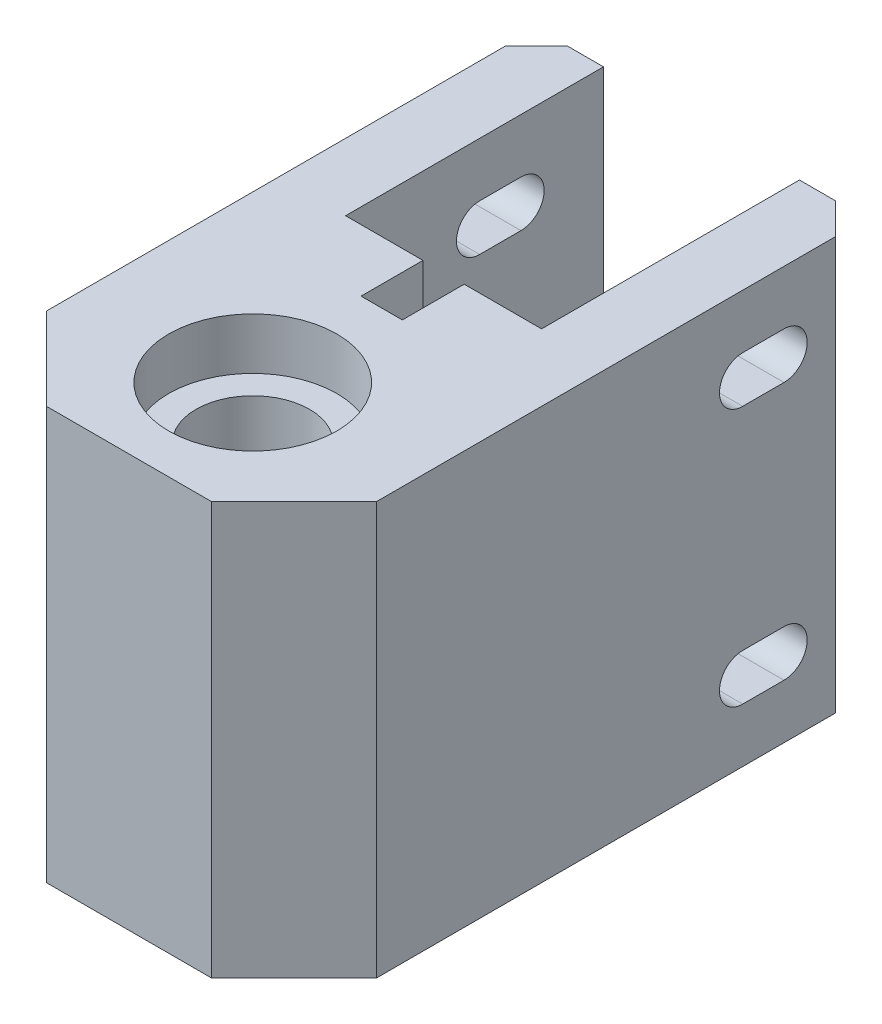
ISO-10303-21;
HEADER;
FILE_DESCRIPTION(('STEP AP214'),'2;1');
FILE_NAME('part.step','',(''),(''),'','','');
FILE_SCHEMA(('AUTOMOTIVE_DESIGN { 1 0 10303 214 1 1 1 1 }'));
ENDSEC;
DATA;
#1=APPLICATION_CONTEXT('core data for automotive mechanical design processes');
#2=APPLICATION_PROTOCOL_DEFINITION('international standard','automotive_design',2000,#1);
#3=PRODUCT_CONTEXT('',#1,'mechanical');
#4=PRODUCT('Part','Part','',(#3));
#5=PRODUCT_RELATED_PRODUCT_CATEGORY('part','',(#4));
#6=PRODUCT_DEFINITION_FORMATION('','',#4);
#7=PRODUCT_DEFINITION_CONTEXT('part definition',#1,'design');
#8=PRODUCT_DEFINITION('design','',#6,#7);
#9=PRODUCT_DEFINITION_SHAPE('','',#8);
#10=(LENGTH_UNIT() NAMED_UNIT(*) SI_UNIT(.MILLI.,.METRE.));
#11=(NAMED_UNIT(*) PLANE_ANGLE_UNIT() SI_UNIT($,.RADIAN.));
#12=(NAMED_UNIT(*) SI_UNIT($,.STERADIAN.) SOLID_ANGLE_UNIT());
#13=UNCERTAINTY_MEASURE_WITH_UNIT(LENGTH_MEASURE(1.E-05),#10,'distance_accuracy_value','');
#14=(GEOMETRIC_REPRESENTATION_CONTEXT(3) GLOBAL_UNCERTAINTY_ASSIGNED_CONTEXT((#13)) GLOBAL_UNIT_ASSIGNED_CONTEXT((#10,
#11,#12)) REPRESENTATION_CONTEXT('',''));
#15=CARTESIAN_POINT('',(0.,0.,0.));
#16=DIRECTION('',(0.,0.,1.));
#17=DIRECTION('',(1.,0.,0.));
#18=AXIS2_PLACEMENT_3D('',#15,#16,#17);
#19=CARTESIAN_POINT('',(0.,20.,0.));
#20=DIRECTION('',(0.,-1.,0.));
#21=DIRECTION('',(0.,0.,-1.));
#22=AXIS2_PLACEMENT_3D('',#19,#20,#21);
#23=CYLINDRICAL_SURFACE('',#22,5.5);
#24=CARTESIAN_POINT('',(0.,15.,0.));
#25=DIRECTION('',(0.,1.,0.));
#26=DIRECTION('',(0.,0.,1.));
#27=AXIS2_PLACEMENT_3D('',#24,#25,#26);
#28=CIRCLE('',#27,5.5);
#29=CARTESIAN_POINT('',(0.,15.,5.5));
#30=VERTEX_POINT('',#29);
#31=EDGE_CURVE('E359',#30,#30,#28,.T.);
#32=ORIENTED_EDGE('',*,*,#31,.T.);
#33=EDGE_LOOP('',(#32));
#34=FACE_BOUND('',#33,.T.);
#35=CARTESIAN_POINT('',(0.,-15.,0.));
#36=DIRECTION('',(0.,-1.,0.));
#37=DIRECTION('',(0.,0.,-1.));
#38=AXIS2_PLACEMENT_3D('',#35,#36,#37);
#39=CIRCLE('',#38,5.5);
#40=CARTESIAN_POINT('',(0.,-15.,-5.5));
#41=VERTEX_POINT('',#40);
#42=EDGE_CURVE('E353',#41,#41,#39,.T.);
#43=ORIENTED_EDGE('',*,*,#42,.T.);
#44=EDGE_LOOP('',(#43));
#45=FACE_BOUND('',#44,.T.);
#46=ADVANCED_FACE('F32',(#34,#45),#23,.F.);
#47=CARTESIAN_POINT('',(0.,-20.,0.));
#48=DIRECTION('',(0.,1.,0.));
#49=DIRECTION('',(0.,0.,1.));
#50=AXIS2_PLACEMENT_3D('',#47,#48,#49);
#51=PLANE('',#50);
#52=DIRECTION('',(-1.,0.,0.));
#53=VECTOR('',#52,1.);
#54=CARTESIAN_POINT('',(-9.5,-20.,-43.5));
#55=LINE('',#54,#53);
#56=CARTESIAN_POINT('',(-9.5,-20.,-43.5));
#57=VERTEX_POINT('',#56);
#58=CARTESIAN_POINT('',(-13.,-20.,-43.5));
#59=VERTEX_POINT('',#58);
#60=EDGE_CURVE('E398',#57,#59,#55,.T.);
#61=ORIENTED_EDGE('',*,*,#60,.F.);
#62=DIRECTION('',(0.,0.,-1.));
#63=VECTOR('',#62,1.);
#64=CARTESIAN_POINT('',(-9.5,-20.,-43.5));
#65=LINE('',#64,#63);
#66=CARTESIAN_POINT('',(-9.5,-20.,-18.5));
#67=VERTEX_POINT('',#66);
#68=EDGE_CURVE('E367',#67,#57,#65,.T.);
#69=ORIENTED_EDGE('',*,*,#68,.F.);
#70=DIRECTION('',(-1.,0.,0.));
#71=VECTOR('',#70,1.);
#72=CARTESIAN_POINT('',(-9.5,-20.,-18.5));
#73=LINE('',#72,#71);
#74=CARTESIAN_POINT('',(-2.,-20.,-18.5));
#75=VERTEX_POINT('',#74);
#76=EDGE_CURVE('E427',#75,#67,#73,.T.);
#77=ORIENTED_EDGE('',*,*,#76,.F.);
#78=DIRECTION('',(0.,0.,-1.));
#79=VECTOR('',#78,1.);
#80=CARTESIAN_POINT('',(-2.,-20.,-18.5));
#81=LINE('',#80,#79);
#82=CARTESIAN_POINT('',(-2.,-20.,-12.5));
#83=VERTEX_POINT('',#82);
#84=EDGE_CURVE('E425',#83,#75,#81,.T.);
#85=ORIENTED_EDGE('',*,*,#84,.F.);
#86=DIRECTION('',(-1.,0.,0.));
#87=VECTOR('',#86,1.);
#88=CARTESIAN_POINT('',(-2.,-20.,-12.5));
#89=LINE('',#88,#87);
#90=CARTESIAN_POINT('',(2.,-20.,-12.5));
#91=VERTEX_POINT('',#90);
#92=EDGE_CURVE('E423',#91,#83,#89,.T.);
#93=ORIENTED_EDGE('',*,*,#92,.F.);
#94=DIRECTION('',(0.,0.,1.));
#95=VECTOR('',#94,1.);
#96=CARTESIAN_POINT('',(2.,-20.,-18.5));
#97=LINE('',#96,#95);
#98=CARTESIAN_POINT('',(2.,-20.,-18.5));
#99=VERTEX_POINT('',#98);
#100=EDGE_CURVE('E421',#99,#91,#97,.T.);
#101=ORIENTED_EDGE('',*,*,#100,.F.);
#102=DIRECTION('',(-1.,0.,0.));
#103=VECTOR('',#102,1.);
#104=CARTESIAN_POINT('',(2.,-20.,-18.5));
#105=LINE('',#104,#103);
#106=CARTESIAN_POINT('',(9.5,-20.,-18.5));
#107=VERTEX_POINT('',#106);
#108=EDGE_CURVE('E419',#107,#99,#105,.T.);
#109=ORIENTED_EDGE('',*,*,#108,.F.);
#110=DIRECTION('',(0.,0.,1.));
#111=VECTOR('',#110,1.);
#112=CARTESIAN_POINT('',(9.5,-20.,-43.5));
#113=LINE('',#112,#111);
#114=CARTESIAN_POINT('',(9.5,-20.,-43.5));
#115=VERTEX_POINT('',#114);
#116=EDGE_CURVE('E417',#115,#107,#113,.T.);
#117=ORIENTED_EDGE('',*,*,#116,.F.);
#118=DIRECTION('',(-1.,0.,0.));
#119=VECTOR('',#118,1.);
#120=CARTESIAN_POINT('',(13.,-20.,-43.5));
#121=LINE('',#120,#119);
#122=CARTESIAN_POINT('',(13.,-20.,-43.5));
#123=VERTEX_POINT('',#122);
#124=EDGE_CURVE('E415',#123,#115,#121,.T.);
#125=ORIENTED_EDGE('',*,*,#124,.F.);
#126=DIRECTION('',(-0.707106781186547,0.,-0.707106781186548));
#127=VECTOR('',#126,1.);
#128=CARTESIAN_POINT('',(16.,-20.,-40.5));
#129=LINE('',#128,#127);
#130=CARTESIAN_POINT('',(16.,-20.,-40.5));
#131=VERTEX_POINT('',#130);
#132=EDGE_CURVE('E413',#131,#123,#129,.T.);
#133=ORIENTED_EDGE('',*,*,#132,.F.);
#134=DIRECTION('',(0.,0.,-1.));
#135=VECTOR('',#134,1.);
#136=CARTESIAN_POINT('',(16.,-20.,4.00000000000001));
#137=LINE('',#136,#135);
#138=CARTESIAN_POINT('',(16.,-20.,4.00000000000001));
#139=VERTEX_POINT('',#138);
#140=EDGE_CURVE('E411',#139,#131,#137,.T.);
#141=ORIENTED_EDGE('',*,*,#140,.F.);
#142=DIRECTION('',(0.707106781186546,0.,-0.707106781186549));
#143=VECTOR('',#142,1.);
#144=CARTESIAN_POINT('',(8.00000000000004,-20.,12.));
#145=LINE('',#144,#143);
#146=CARTESIAN_POINT('',(8.00000000000004,-20.,12.));
#147=VERTEX_POINT('',#146);
#148=EDGE_CURVE('E409',#147,#139,#145,.T.);
#149=ORIENTED_EDGE('',*,*,#148,.F.);
#150=DIRECTION('',(1.,0.,0.));
#151=VECTOR('',#150,1.);
#152=CARTESIAN_POINT('',(-8.00000000000001,-20.,12.));
#153=LINE('',#152,#151);
#154=CARTESIAN_POINT('',(-8.00000000000001,-20.,12.));
#155=VERTEX_POINT('',#154);
#156=EDGE_CURVE('E407',#155,#147,#153,.T.);
#157=ORIENTED_EDGE('',*,*,#156,.F.);
#158=DIRECTION('',(0.707106781186549,0.,0.707106781186546));
#159=VECTOR('',#158,1.);
#160=CARTESIAN_POINT('',(-16.,-20.,4.00000000000003));
#161=LINE('',#160,#159);
#162=CARTESIAN_POINT('',(-16.,-20.,4.00000000000003));
#163=VERTEX_POINT('',#162);
#164=EDGE_CURVE('E405',#163,#155,#161,.T.);
#165=ORIENTED_EDGE('',*,*,#164,.F.);
#166=DIRECTION('',(0.,0.,1.));
#167=VECTOR('',#166,1.);
#168=CARTESIAN_POINT('',(-16.,-20.,-40.5));
#169=LINE('',#168,#167);
#170=CARTESIAN_POINT('',(-16.,-20.,-40.5));
#171=VERTEX_POINT('',#170);
#172=EDGE_CURVE('E403',#171,#163,#169,.T.);
#173=ORIENTED_EDGE('',*,*,#172,.F.);
#174=DIRECTION('',(-0.707106781186546,0.,0.707106781186549));
#175=VECTOR('',#174,1.);
#176=CARTESIAN_POINT('',(-13.,-20.,-43.5));
#177=LINE('',#176,#175);
#178=EDGE_CURVE('E401',#59,#171,#177,.T.);
#179=ORIENTED_EDGE('',*,*,#178,.F.);
#180=EDGE_LOOP('',(#61,#69,#77,#85,#93,#101,#109,#117,#125,#133,#141,#149,#157,#165,#173,#179));
#181=FACE_BOUND('',#180,.T.);
#182=CARTESIAN_POINT('',(0.,-20.,0.));
#183=DIRECTION('',(0.,1.,0.));
#184=DIRECTION('',(0.,0.,1.));
#185=AXIS2_PLACEMENT_3D('',#182,#183,#184);
#186=CIRCLE('',#185,8.15);
#187=CARTESIAN_POINT('',(0.,-20.,8.15));
#188=VERTEX_POINT('',#187);
#189=EDGE_CURVE('E349',#188,#188,#186,.T.);
#190=ORIENTED_EDGE('',*,*,#189,.T.);
#191=EDGE_LOOP('',(#190));
#192=FACE_BOUND('',#191,.T.);
#193=ADVANCED_FACE('F519',(#181,#192),#51,.F.);
#194=CARTESIAN_POINT('',(0.,20.,0.));
#195=DIRECTION('',(0.,1.,0.));
#196=DIRECTION('',(0.,0.,1.));
#197=AXIS2_PLACEMENT_3D('',#194,#195,#196);
#198=PLANE('',#197);
#199=CARTESIAN_POINT('',(0.,20.,0.));
#200=DIRECTION('',(0.,1.,0.));
#201=DIRECTION('',(0.,0.,1.));
#202=AXIS2_PLACEMENT_3D('',#199,#200,#201);
#203=CIRCLE('',#202,8.15);
#204=CARTESIAN_POINT('',(0.,20.,8.15));
#205=VERTEX_POINT('',#204);
#206=EDGE_CURVE('E360',#205,#205,#203,.T.);
#207=ORIENTED_EDGE('',*,*,#206,.F.);
#208=EDGE_LOOP('',(#207));
#209=FACE_BOUND('',#208,.T.);
#210=DIRECTION('',(-1.,0.,0.));
#211=VECTOR('',#210,1.);
#212=CARTESIAN_POINT('',(-9.5,20.,-43.5));
#213=LINE('',#212,#211);
#214=CARTESIAN_POINT('',(-9.5,20.,-43.5));
#215=VERTEX_POINT('',#214);
#216=CARTESIAN_POINT('',(-13.,20.,-43.5));
#217=VERTEX_POINT('',#216);
#218=EDGE_CURVE('E363',#215,#217,#213,.T.);
#219=ORIENTED_EDGE('',*,*,#218,.T.);
#220=DIRECTION('',(-0.707106781186546,0.,0.707106781186549));
#221=VECTOR('',#220,1.);
#222=CARTESIAN_POINT('',(-13.,20.,-43.5));
#223=LINE('',#222,#221);
#224=CARTESIAN_POINT('',(-16.,20.,-40.5));
#225=VERTEX_POINT('',#224);
#226=EDGE_CURVE('E366',#217,#225,#223,.T.);
#227=ORIENTED_EDGE('',*,*,#226,.T.);
#228=DIRECTION('',(0.,0.,1.));
#229=VECTOR('',#228,1.);
#230=CARTESIAN_POINT('',(-16.,20.,-40.5));
#231=LINE('',#230,#229);
#232=CARTESIAN_POINT('',(-16.,20.,4.00000000000003));
#233=VERTEX_POINT('',#232);
#234=EDGE_CURVE('E369',#225,#233,#231,.T.);
#235=ORIENTED_EDGE('',*,*,#234,.T.);
#236=DIRECTION('',(0.707106781186549,0.,0.707106781186546));
#237=VECTOR('',#236,1.);
#238=CARTESIAN_POINT('',(-16.,20.,4.00000000000003));
#239=LINE('',#238,#237);
#240=CARTESIAN_POINT('',(-8.00000000000001,20.,12.));
#241=VERTEX_POINT('',#240);
#242=EDGE_CURVE('E371',#233,#241,#239,.T.);
#243=ORIENTED_EDGE('',*,*,#242,.T.);
#244=DIRECTION('',(1.,0.,0.));
#245=VECTOR('',#244,1.);
#246=CARTESIAN_POINT('',(-8.00000000000001,20.,12.));
#247=LINE('',#246,#245);
#248=CARTESIAN_POINT('',(8.00000000000004,20.,12.));
#249=VERTEX_POINT('',#248);
#250=EDGE_CURVE('E373',#241,#249,#247,.T.);
#251=ORIENTED_EDGE('',*,*,#250,.T.);
#252=DIRECTION('',(0.707106781186546,0.,-0.707106781186549));
#253=VECTOR('',#252,1.);
#254=CARTESIAN_POINT('',(8.00000000000004,20.,12.));
#255=LINE('',#254,#253);
#256=CARTESIAN_POINT('',(16.,20.,4.00000000000001));
#257=VERTEX_POINT('',#256);
#258=EDGE_CURVE('E375',#249,#257,#255,.T.);
#259=ORIENTED_EDGE('',*,*,#258,.T.);
#260=DIRECTION('',(0.,0.,-1.));
#261=VECTOR('',#260,1.);
#262=CARTESIAN_POINT('',(16.,20.,4.00000000000001));
#263=LINE('',#262,#261);
#264=CARTESIAN_POINT('',(16.,20.,-40.5));
#265=VERTEX_POINT('',#264);
#266=EDGE_CURVE('E377',#257,#265,#263,.T.);
#267=ORIENTED_EDGE('',*,*,#266,.T.);
#268=DIRECTION('',(-0.707106781186547,0.,-0.707106781186548));
#269=VECTOR('',#268,1.);
#270=CARTESIAN_POINT('',(16.,20.,-40.5));
#271=LINE('',#270,#269);
#272=CARTESIAN_POINT('',(13.,20.,-43.5));
#273=VERTEX_POINT('',#272);
#274=EDGE_CURVE('E379',#265,#273,#271,.T.);
#275=ORIENTED_EDGE('',*,*,#274,.T.);
#276=DIRECTION('',(-1.,0.,0.));
#277=VECTOR('',#276,1.);
#278=CARTESIAN_POINT('',(13.,20.,-43.5));
#279=LINE('',#278,#277);
#280=CARTESIAN_POINT('',(9.5,20.,-43.5));
#281=VERTEX_POINT('',#280);
#282=EDGE_CURVE('E381',#273,#281,#279,.T.);
#283=ORIENTED_EDGE('',*,*,#282,.T.);
#284=DIRECTION('',(0.,0.,1.));
#285=VECTOR('',#284,1.);
#286=CARTESIAN_POINT('',(9.5,20.,-43.5));
#287=LINE('',#286,#285);
#288=CARTESIAN_POINT('',(9.5,20.,-18.5));
#289=VERTEX_POINT('',#288);
#290=EDGE_CURVE('E383',#281,#289,#287,.T.);
#291=ORIENTED_EDGE('',*,*,#290,.T.);
#292=DIRECTION('',(-1.,0.,0.));
#293=VECTOR('',#292,1.);
#294=CARTESIAN_POINT('',(2.,20.,-18.5));
#295=LINE('',#294,#293);
#296=CARTESIAN_POINT('',(2.,20.,-18.5));
#297=VERTEX_POINT('',#296);
#298=EDGE_CURVE('E385',#289,#297,#295,.T.);
#299=ORIENTED_EDGE('',*,*,#298,.T.);
#300=DIRECTION('',(0.,0.,1.));
#301=VECTOR('',#300,1.);
#302=CARTESIAN_POINT('',(2.,20.,-18.5));
#303=LINE('',#302,#301);
#304=CARTESIAN_POINT('',(2.,20.,-12.5));
#305=VERTEX_POINT('',#304);
#306=EDGE_CURVE('E387',#297,#305,#303,.T.);
#307=ORIENTED_EDGE('',*,*,#306,.T.);
#308=DIRECTION('',(-1.,0.,0.));
#309=VECTOR('',#308,1.);
#310=CARTESIAN_POINT('',(-2.,20.,-12.5));
#311=LINE('',#310,#309);
#312=CARTESIAN_POINT('',(-2.,20.,-12.5));
#313=VERTEX_POINT('',#312);
#314=EDGE_CURVE('E389',#305,#313,#311,.T.);
#315=ORIENTED_EDGE('',*,*,#314,.T.);
#316=DIRECTION('',(0.,0.,-1.));
#317=VECTOR('',#316,1.);
#318=CARTESIAN_POINT('',(-2.,20.,-18.5));
#319=LINE('',#318,#317);
#320=CARTESIAN_POINT('',(-2.,20.,-18.5));
#321=VERTEX_POINT('',#320);
#322=EDGE_CURVE('E391',#313,#321,#319,.T.);
#323=ORIENTED_EDGE('',*,*,#322,.T.);
#324=DIRECTION('',(-1.,0.,0.));
#325=VECTOR('',#324,1.);
#326=CARTESIAN_POINT('',(-9.5,20.,-18.5));
#327=LINE('',#326,#325);
#328=CARTESIAN_POINT('',(-9.5,20.,-18.5));
#329=VERTEX_POINT('',#328);
#330=EDGE_CURVE('E393',#321,#329,#327,.T.);
#331=ORIENTED_EDGE('',*,*,#330,.T.);
#332=DIRECTION('',(0.,0.,-1.));
#333=VECTOR('',#332,1.);
#334=CARTESIAN_POINT('',(-9.5,20.,-43.5));
#335=LINE('',#334,#333);
#336=EDGE_CURVE('E395',#329,#215,#335,.T.);
#337=ORIENTED_EDGE('',*,*,#336,.T.);
#338=EDGE_LOOP('',(#219,#227,#235,#243,#251,#259,#267,#275,#283,#291,#299,#307,#315,#323,#331,#337));
#339=FACE_BOUND('',#338,.T.);
#340=ADVANCED_FACE('F525',(#209,#339),#198,.T.);
#341=CARTESIAN_POINT('',(-9.5,20.,-43.5));
#342=DIRECTION('',(0.,0.,1.));
#343=DIRECTION('',(1.,0.,0.));
#344=AXIS2_PLACEMENT_3D('',#341,#342,#343);
#345=PLANE('',#344);
#346=ORIENTED_EDGE('',*,*,#60,.T.);
#347=DIRECTION('',(0.,-1.,0.));
#348=VECTOR('',#347,1.);
#349=CARTESIAN_POINT('',(-13.,20.,-43.5));
#350=LINE('',#349,#348);
#351=EDGE_CURVE('E474',#217,#59,#350,.T.);
#352=ORIENTED_EDGE('',*,*,#351,.F.);
#353=ORIENTED_EDGE('',*,*,#218,.F.);
#354=DIRECTION('',(0.,-1.,0.));
#355=VECTOR('',#354,1.);
#356=CARTESIAN_POINT('',(-9.5,20.,-43.5));
#357=LINE('',#356,#355);
#358=EDGE_CURVE('E397',#215,#57,#357,.T.);
#359=ORIENTED_EDGE('',*,*,#358,.T.);
#360=EDGE_LOOP('',(#346,#352,#353,#359));
#361=FACE_BOUND('',#360,.T.);
#362=ADVANCED_FACE('F34',(#361),#345,.F.);
#363=CARTESIAN_POINT('',(-13.,20.,-43.5));
#364=DIRECTION('',(0.707106781186549,0.,0.707106781186546));
#365=DIRECTION('',(0.707106781186546,0.,-0.707106781186549));
#366=AXIS2_PLACEMENT_3D('',#363,#364,#365);
#367=PLANE('',#366);
#368=ORIENTED_EDGE('',*,*,#178,.T.);
#369=DIRECTION('',(0.,-1.,0.));
#370=VECTOR('',#369,1.);
#371=CARTESIAN_POINT('',(-16.,20.,-40.5));
#372=LINE('',#371,#370);
#373=EDGE_CURVE('E471',#225,#171,#372,.T.);
#374=ORIENTED_EDGE('',*,*,#373,.F.);
#375=ORIENTED_EDGE('',*,*,#226,.F.);
#376=ORIENTED_EDGE('',*,*,#351,.T.);
#377=EDGE_LOOP('',(#368,#374,#375,#376));
#378=FACE_BOUND('',#377,.T.);
#379=ADVANCED_FACE('F587',(#378),#367,.F.);
#380=CARTESIAN_POINT('',(-16.,20.,-40.5));
#381=DIRECTION('',(1.,0.,0.));
#382=DIRECTION('',(0.,0.,-1.));
#383=AXIS2_PLACEMENT_3D('',#380,#381,#382);
#384=PLANE('',#383);
#385=DIRECTION('',(0.,0.,-1.));
#386=VECTOR('',#385,1.);
#387=CARTESIAN_POINT('',(-16.,-14.75,-35.5));
#388=LINE('',#387,#386);
#389=CARTESIAN_POINT('',(-16.,-14.75,-31.5));
#390=VERTEX_POINT('',#389);
#391=CARTESIAN_POINT('',(-16.,-14.75,-35.5));
#392=VERTEX_POINT('',#391);
#393=EDGE_CURVE('E264',#390,#392,#388,.T.);
#394=ORIENTED_EDGE('',*,*,#393,.T.);
#395=CARTESIAN_POINT('',(-16.,-12.5,-35.5));
#396=DIRECTION('',(1.,0.,0.));
#397=DIRECTION('',(0.,0.,-1.));
#398=AXIS2_PLACEMENT_3D('',#395,#396,#397);
#399=CIRCLE('',#398,2.25);
#400=CARTESIAN_POINT('',(-16.,-10.25,-35.5));
#401=VERTEX_POINT('',#400);
#402=EDGE_CURVE('E248',#392,#401,#399,.T.);
#403=ORIENTED_EDGE('',*,*,#402,.T.);
#404=DIRECTION('',(0.,0.,1.));
#405=VECTOR('',#404,1.);
#406=CARTESIAN_POINT('',(-16.,-10.25,-35.5));
#407=LINE('',#406,#405);
#408=CARTESIAN_POINT('',(-16.,-10.25,-31.5));
#409=VERTEX_POINT('',#408);
#410=EDGE_CURVE('E256',#401,#409,#407,.T.);
#411=ORIENTED_EDGE('',*,*,#410,.T.);
#412=CARTESIAN_POINT('',(-16.,-12.5,-31.5));
#413=DIRECTION('',(1.,0.,0.));
#414=DIRECTION('',(0.,0.,-1.));
#415=AXIS2_PLACEMENT_3D('',#412,#413,#414);
#416=CIRCLE('',#415,2.25);
#417=EDGE_CURVE('E47',#409,#390,#416,.T.);
#418=ORIENTED_EDGE('',*,*,#417,.T.);
#419=EDGE_LOOP('',(#394,#403,#411,#418));
#420=FACE_BOUND('',#419,.T.);
#421=DIRECTION('',(0.,0.,-1.));
#422=VECTOR('',#421,1.);
#423=CARTESIAN_POINT('',(-16.,10.25,-35.5));
#424=LINE('',#423,#422);
#425=CARTESIAN_POINT('',(-16.,10.25,-31.5));
#426=VERTEX_POINT('',#425);
#427=CARTESIAN_POINT('',(-16.,10.25,-35.5));
#428=VERTEX_POINT('',#427);
#429=EDGE_CURVE('E310',#426,#428,#424,.T.);
#430=ORIENTED_EDGE('',*,*,#429,.T.);
#431=CARTESIAN_POINT('',(-16.,12.5,-35.5));
#432=DIRECTION('',(1.,0.,0.));
#433=DIRECTION('',(0.,0.,-1.));
#434=AXIS2_PLACEMENT_3D('',#431,#432,#433);
#435=CIRCLE('',#434,2.25);
#436=CARTESIAN_POINT('',(-16.,14.75,-35.5));
#437=VERTEX_POINT('',#436);
#438=EDGE_CURVE('E300',#428,#437,#435,.T.);
#439=ORIENTED_EDGE('',*,*,#438,.T.);
#440=DIRECTION('',(0.,0.,1.));
#441=VECTOR('',#440,1.);
#442=CARTESIAN_POINT('',(-16.,14.75,-35.5));
#443=LINE('',#442,#441);
#444=CARTESIAN_POINT('',(-16.,14.75,-31.5));
#445=VERTEX_POINT('',#444);
#446=EDGE_CURVE('E303',#437,#445,#443,.T.);
#447=ORIENTED_EDGE('',*,*,#446,.T.);
#448=CARTESIAN_POINT('',(-16.,12.5,-31.5));
#449=DIRECTION('',(1.,0.,0.));
#450=DIRECTION('',(0.,0.,-1.));
#451=AXIS2_PLACEMENT_3D('',#448,#449,#450);
#452=CIRCLE('',#451,2.25);
#453=EDGE_CURVE('E307',#445,#426,#452,.T.);
#454=ORIENTED_EDGE('',*,*,#453,.T.);
#455=EDGE_LOOP('',(#430,#439,#447,#454));
#456=FACE_BOUND('',#455,.T.);
#457=ORIENTED_EDGE('',*,*,#172,.T.);
#458=DIRECTION('',(0.,-1.,0.));
#459=VECTOR('',#458,1.);
#460=CARTESIAN_POINT('',(-16.,20.,4.00000000000003));
#461=LINE('',#460,#459);
#462=EDGE_CURVE('E468',#233,#163,#461,.T.);
#463=ORIENTED_EDGE('',*,*,#462,.F.);
#464=ORIENTED_EDGE('',*,*,#234,.F.);
#465=ORIENTED_EDGE('',*,*,#373,.T.);
#466=EDGE_LOOP('',(#457,#463,#464,#465));
#467=FACE_BOUND('',#466,.T.);
#468=ADVANCED_FACE('F261',(#420,#456,#467),#384,.F.);
#469=CARTESIAN_POINT('',(-16.,20.,4.00000000000003));
#470=DIRECTION('',(0.707106781186546,0.,-0.707106781186549));
#471=DIRECTION('',(-0.707106781186549,0.,-0.707106781186546));
#472=AXIS2_PLACEMENT_3D('',#469,#470,#471);
#473=PLANE('',#472);
#474=ORIENTED_EDGE('',*,*,#164,.T.);
#475=DIRECTION('',(0.,-1.,0.));
#476=VECTOR('',#475,1.);
#477=CARTESIAN_POINT('',(-8.00000000000001,20.,12.));
#478=LINE('',#477,#476);
#479=EDGE_CURVE('E465',#241,#155,#478,.T.);
#480=ORIENTED_EDGE('',*,*,#479,.F.);
#481=ORIENTED_EDGE('',*,*,#242,.F.);
#482=ORIENTED_EDGE('',*,*,#462,.T.);
#483=EDGE_LOOP('',(#474,#480,#481,#482));
#484=FACE_BOUND('',#483,.T.);
#485=ADVANCED_FACE('F581',(#484),#473,.F.);
#486=CARTESIAN_POINT('',(-8.00000000000001,20.,12.));
#487=DIRECTION('',(0.,0.,-1.));
#488=DIRECTION('',(-1.,0.,0.));
#489=AXIS2_PLACEMENT_3D('',#486,#487,#488);
#490=PLANE('',#489);
#491=ORIENTED_EDGE('',*,*,#156,.T.);
#492=DIRECTION('',(0.,-1.,0.));
#493=VECTOR('',#492,1.);
#494=CARTESIAN_POINT('',(8.00000000000004,20.,12.));
#495=LINE('',#494,#493);
#496=EDGE_CURVE('E462',#249,#147,#495,.T.);
#497=ORIENTED_EDGE('',*,*,#496,.F.);
#498=ORIENTED_EDGE('',*,*,#250,.F.);
#499=ORIENTED_EDGE('',*,*,#479,.T.);
#500=EDGE_LOOP('',(#491,#497,#498,#499));
#501=FACE_BOUND('',#500,.T.);
#502=ADVANCED_FACE('F577',(#501),#490,.F.);
#503=CARTESIAN_POINT('',(8.00000000000004,20.,12.));
#504=DIRECTION('',(-0.707106781186549,0.,-0.707106781186546));
#505=DIRECTION('',(-0.707106781186546,0.,0.707106781186549));
#506=AXIS2_PLACEMENT_3D('',#503,#504,#505);
#507=PLANE('',#506);
#508=ORIENTED_EDGE('',*,*,#148,.T.);
#509=DIRECTION('',(0.,-1.,0.));
#510=VECTOR('',#509,1.);
#511=CARTESIAN_POINT('',(16.,20.,4.00000000000001));
#512=LINE('',#511,#510);
#513=EDGE_CURVE('E459',#257,#139,#512,.T.);
#514=ORIENTED_EDGE('',*,*,#513,.F.);
#515=ORIENTED_EDGE('',*,*,#258,.F.);
#516=ORIENTED_EDGE('',*,*,#496,.T.);
#517=EDGE_LOOP('',(#508,#514,#515,#516));
#518=FACE_BOUND('',#517,.T.);
#519=ADVANCED_FACE('F573',(#518),#507,.F.);
#520=CARTESIAN_POINT('',(16.,20.,4.00000000000001));
#521=DIRECTION('',(-1.,0.,0.));
#522=DIRECTION('',(0.,0.,1.));
#523=AXIS2_PLACEMENT_3D('',#520,#521,#522);
#524=PLANE('',#523);
#525=DIRECTION('',(0.,0.,1.));
#526=VECTOR('',#525,1.);
#527=CARTESIAN_POINT('',(16.,-10.25,-35.5));
#528=LINE('',#527,#526);
#529=CARTESIAN_POINT('',(16.,-10.25,-35.5));
#530=VERTEX_POINT('',#529);
#531=CARTESIAN_POINT('',(16.,-10.25,-31.5));
#532=VERTEX_POINT('',#531);
#533=EDGE_CURVE('E274',#530,#532,#528,.T.);
#534=ORIENTED_EDGE('',*,*,#533,.F.);
#535=CARTESIAN_POINT('',(16.,-12.5,-35.5));
#536=DIRECTION('',(1.,0.,0.));
#537=DIRECTION('',(0.,0.,-1.));
#538=AXIS2_PLACEMENT_3D('',#535,#536,#537);
#539=CIRCLE('',#538,2.25);
#540=CARTESIAN_POINT('',(16.,-14.75,-35.5));
#541=VERTEX_POINT('',#540);
#542=EDGE_CURVE('E55',#541,#530,#539,.T.);
#543=ORIENTED_EDGE('',*,*,#542,.F.);
#544=DIRECTION('',(0.,0.,-1.));
#545=VECTOR('',#544,1.);
#546=CARTESIAN_POINT('',(16.,-14.75,-35.5));
#547=LINE('',#546,#545);
#548=CARTESIAN_POINT('',(16.,-14.75,-31.5));
#549=VERTEX_POINT('',#548);
#550=EDGE_CURVE('E265',#549,#541,#547,.T.);
#551=ORIENTED_EDGE('',*,*,#550,.F.);
#552=CARTESIAN_POINT('',(16.,-12.5,-31.5));
#553=DIRECTION('',(1.,0.,0.));
#554=DIRECTION('',(0.,0.,-1.));
#555=AXIS2_PLACEMENT_3D('',#552,#553,#554);
#556=CIRCLE('',#555,2.25);
#557=EDGE_CURVE('E268',#532,#549,#556,.T.);
#558=ORIENTED_EDGE('',*,*,#557,.F.);
#559=EDGE_LOOP('',(#534,#543,#551,#558));
#560=FACE_BOUND('',#559,.T.);
#561=DIRECTION('',(0.,0.,1.));
#562=VECTOR('',#561,1.);
#563=CARTESIAN_POINT('',(16.,14.75,-35.5));
#564=LINE('',#563,#562);
#565=CARTESIAN_POINT('',(16.,14.75,-35.5));
#566=VERTEX_POINT('',#565);
#567=CARTESIAN_POINT('',(16.,14.75,-31.5));
#568=VERTEX_POINT('',#567);
#569=EDGE_CURVE('E315',#566,#568,#564,.T.);
#570=ORIENTED_EDGE('',*,*,#569,.F.);
#571=CARTESIAN_POINT('',(16.,12.5,-35.5));
#572=DIRECTION('',(1.,0.,0.));
#573=DIRECTION('',(0.,0.,-1.));
#574=AXIS2_PLACEMENT_3D('',#571,#572,#573);
#575=CIRCLE('',#574,2.25);
#576=CARTESIAN_POINT('',(16.,10.25,-35.5));
#577=VERTEX_POINT('',#576);
#578=EDGE_CURVE('E299',#577,#566,#575,.T.);
#579=ORIENTED_EDGE('',*,*,#578,.F.);
#580=DIRECTION('',(0.,0.,-1.));
#581=VECTOR('',#580,1.);
#582=CARTESIAN_POINT('',(16.,10.25,-35.5));
#583=LINE('',#582,#581);
#584=CARTESIAN_POINT('',(16.,10.25,-31.5));
#585=VERTEX_POINT('',#584);
#586=EDGE_CURVE('E304',#585,#577,#583,.T.);
#587=ORIENTED_EDGE('',*,*,#586,.F.);
#588=CARTESIAN_POINT('',(16.,12.5,-31.5));
#589=DIRECTION('',(1.,0.,0.));
#590=DIRECTION('',(0.,0.,-1.));
#591=AXIS2_PLACEMENT_3D('',#588,#589,#590);
#592=CIRCLE('',#591,2.25);
#593=EDGE_CURVE('E318',#568,#585,#592,.T.);
#594=ORIENTED_EDGE('',*,*,#593,.F.);
#595=EDGE_LOOP('',(#570,#579,#587,#594));
#596=FACE_BOUND('',#595,.T.);
#597=ORIENTED_EDGE('',*,*,#140,.T.);
#598=DIRECTION('',(0.,-1.,0.));
#599=VECTOR('',#598,1.);
#600=CARTESIAN_POINT('',(16.,20.,-40.5));
#601=LINE('',#600,#599);
#602=EDGE_CURVE('E456',#265,#131,#601,.T.);
#603=ORIENTED_EDGE('',*,*,#602,.F.);
#604=ORIENTED_EDGE('',*,*,#266,.F.);
#605=ORIENTED_EDGE('',*,*,#513,.T.);
#606=EDGE_LOOP('',(#597,#603,#604,#605));
#607=FACE_BOUND('',#606,.T.);
#608=ADVANCED_FACE('F569',(#560,#596,#607),#524,.F.);
#609=CARTESIAN_POINT('',(16.,20.,-40.5));
#610=DIRECTION('',(-0.707106781186548,0.,0.707106781186547));
#611=DIRECTION('',(0.707106781186547,0.,0.707106781186548));
#612=AXIS2_PLACEMENT_3D('',#609,#610,#611);
#613=PLANE('',#612);
#614=ORIENTED_EDGE('',*,*,#132,.T.);
#615=DIRECTION('',(0.,-1.,0.));
#616=VECTOR('',#615,1.);
#617=CARTESIAN_POINT('',(13.,20.,-43.5));
#618=LINE('',#617,#616);
#619=EDGE_CURVE('E453',#273,#123,#618,.T.);
#620=ORIENTED_EDGE('',*,*,#619,.F.);
#621=ORIENTED_EDGE('',*,*,#274,.F.);
#622=ORIENTED_EDGE('',*,*,#602,.T.);
#623=EDGE_LOOP('',(#614,#620,#621,#622));
#624=FACE_BOUND('',#623,.T.);
#625=ADVANCED_FACE('F565',(#624),#613,.F.);
#626=CARTESIAN_POINT('',(13.,20.,-43.5));
#627=DIRECTION('',(0.,0.,1.));
#628=DIRECTION('',(1.,0.,0.));
#629=AXIS2_PLACEMENT_3D('',#626,#627,#628);
#630=PLANE('',#629);
#631=ORIENTED_EDGE('',*,*,#124,.T.);
#632=DIRECTION('',(0.,-1.,0.));
#633=VECTOR('',#632,1.);
#634=CARTESIAN_POINT('',(9.5,20.,-43.5));
#635=LINE('',#634,#633);
#636=EDGE_CURVE('E450',#281,#115,#635,.T.);
#637=ORIENTED_EDGE('',*,*,#636,.F.);
#638=ORIENTED_EDGE('',*,*,#282,.F.);
#639=ORIENTED_EDGE('',*,*,#619,.T.);
#640=EDGE_LOOP('',(#631,#637,#638,#639));
#641=FACE_BOUND('',#640,.T.);
#642=ADVANCED_FACE('F561',(#641),#630,.F.);
#643=CARTESIAN_POINT('',(9.5,20.,-43.5));
#644=DIRECTION('',(1.,0.,0.));
#645=DIRECTION('',(0.,0.,-1.));
#646=AXIS2_PLACEMENT_3D('',#643,#644,#645);
#647=PLANE('',#646);
#648=DIRECTION('',(0.,0.,-1.));
#649=VECTOR('',#648,1.);
#650=CARTESIAN_POINT('',(9.5,-14.75,-43.5));
#651=LINE('',#650,#649);
#652=CARTESIAN_POINT('',(9.5,-14.75,-31.5));
#653=VERTEX_POINT('',#652);
#654=CARTESIAN_POINT('',(9.5,-14.75,-35.5));
#655=VERTEX_POINT('',#654);
#656=EDGE_CURVE('E293',#653,#655,#651,.T.);
#657=ORIENTED_EDGE('',*,*,#656,.T.);
#658=CARTESIAN_POINT('',(9.5,-12.5,-35.5));
#659=DIRECTION('',(1.,0.,0.));
#660=DIRECTION('',(0.,0.,-1.));
#661=AXIS2_PLACEMENT_3D('',#658,#659,#660);
#662=CIRCLE('',#661,2.25);
#663=CARTESIAN_POINT('',(9.5,-10.25,-35.5));
#664=VERTEX_POINT('',#663);
#665=EDGE_CURVE('E296',#655,#664,#662,.T.);
#666=ORIENTED_EDGE('',*,*,#665,.T.);
#667=DIRECTION('',(0.,0.,1.));
#668=VECTOR('',#667,1.);
#669=CARTESIAN_POINT('',(9.5,-10.25,-43.5));
#670=LINE('',#669,#668);
#671=CARTESIAN_POINT('',(9.5,-10.25,-31.5));
#672=VERTEX_POINT('',#671);
#673=EDGE_CURVE('E281',#664,#672,#670,.T.);
#674=ORIENTED_EDGE('',*,*,#673,.T.);
#675=CARTESIAN_POINT('',(9.5,-12.5,-31.5));
#676=DIRECTION('',(1.,0.,0.));
#677=DIRECTION('',(0.,0.,-1.));
#678=AXIS2_PLACEMENT_3D('',#675,#676,#677);
#679=CIRCLE('',#678,2.25);
#680=EDGE_CURVE('E290',#672,#653,#679,.T.);
#681=ORIENTED_EDGE('',*,*,#680,.T.);
#682=EDGE_LOOP('',(#657,#666,#674,#681));
#683=FACE_BOUND('',#682,.T.);
#684=DIRECTION('',(0.,0.,-1.));
#685=VECTOR('',#684,1.);
#686=CARTESIAN_POINT('',(9.5,10.25,-43.5));
#687=LINE('',#686,#685);
#688=CARTESIAN_POINT('',(9.5,10.25,-31.5));
#689=VERTEX_POINT('',#688);
#690=CARTESIAN_POINT('',(9.5,10.25,-35.5));
#691=VERTEX_POINT('',#690);
#692=EDGE_CURVE('E343',#689,#691,#687,.T.);
#693=ORIENTED_EDGE('',*,*,#692,.T.);
#694=CARTESIAN_POINT('',(9.5,12.5,-35.5));
#695=DIRECTION('',(1.,0.,0.));
#696=DIRECTION('',(0.,0.,-1.));
#697=AXIS2_PLACEMENT_3D('',#694,#695,#696);
#698=CIRCLE('',#697,2.25);
#699=CARTESIAN_POINT('',(9.5,14.75,-35.5));
#700=VERTEX_POINT('',#699);
#701=EDGE_CURVE('E346',#691,#700,#698,.T.);
#702=ORIENTED_EDGE('',*,*,#701,.T.);
#703=DIRECTION('',(0.,0.,1.));
#704=VECTOR('',#703,1.);
#705=CARTESIAN_POINT('',(9.5,14.75,-43.5));
#706=LINE('',#705,#704);
#707=CARTESIAN_POINT('',(9.5,14.75,-31.5));
#708=VERTEX_POINT('',#707);
#709=EDGE_CURVE('E326',#700,#708,#706,.T.);
#710=ORIENTED_EDGE('',*,*,#709,.T.);
#711=CARTESIAN_POINT('',(9.5,12.5,-31.5));
#712=DIRECTION('',(1.,0.,0.));
#713=DIRECTION('',(0.,0.,-1.));
#714=AXIS2_PLACEMENT_3D('',#711,#712,#713);
#715=CIRCLE('',#714,2.25);
#716=EDGE_CURVE('E340',#708,#689,#715,.T.);
#717=ORIENTED_EDGE('',*,*,#716,.T.);
#718=EDGE_LOOP('',(#693,#702,#710,#717));
#719=FACE_BOUND('',#718,.T.);
#720=ORIENTED_EDGE('',*,*,#116,.T.);
#721=DIRECTION('',(0.,-1.,0.));
#722=VECTOR('',#721,1.);
#723=CARTESIAN_POINT('',(9.5,20.,-18.5));
#724=LINE('',#723,#722);
#725=EDGE_CURVE('E447',#289,#107,#724,.T.);
#726=ORIENTED_EDGE('',*,*,#725,.F.);
#727=ORIENTED_EDGE('',*,*,#290,.F.);
#728=ORIENTED_EDGE('',*,*,#636,.T.);
#729=EDGE_LOOP('',(#720,#726,#727,#728));
#730=FACE_BOUND('',#729,.T.);
#731=ADVANCED_FACE('F557',(#683,#719,#730),#647,.F.);
#732=CARTESIAN_POINT('',(2.,20.,-18.5));
#733=DIRECTION('',(0.,0.,1.));
#734=DIRECTION('',(1.,0.,0.));
#735=AXIS2_PLACEMENT_3D('',#732,#733,#734);
#736=PLANE('',#735);
#737=ORIENTED_EDGE('',*,*,#108,.T.);
#738=DIRECTION('',(0.,-1.,0.));
#739=VECTOR('',#738,1.);
#740=CARTESIAN_POINT('',(2.,20.,-18.5));
#741=LINE('',#740,#739);
#742=EDGE_CURVE('E444',#297,#99,#741,.T.);
#743=ORIENTED_EDGE('',*,*,#742,.F.);
#744=ORIENTED_EDGE('',*,*,#298,.F.);
#745=ORIENTED_EDGE('',*,*,#725,.T.);
#746=EDGE_LOOP('',(#737,#743,#744,#745));
#747=FACE_BOUND('',#746,.T.);
#748=ADVANCED_FACE('F553',(#747),#736,.F.);
#749=CARTESIAN_POINT('',(2.,20.,-18.5));
#750=DIRECTION('',(1.,0.,0.));
#751=DIRECTION('',(0.,0.,-1.));
#752=AXIS2_PLACEMENT_3D('',#749,#750,#751);
#753=PLANE('',#752);
#754=ORIENTED_EDGE('',*,*,#100,.T.);
#755=DIRECTION('',(0.,-1.,0.));
#756=VECTOR('',#755,1.);
#757=CARTESIAN_POINT('',(2.,20.,-12.5));
#758=LINE('',#757,#756);
#759=EDGE_CURVE('E441',#305,#91,#758,.T.);
#760=ORIENTED_EDGE('',*,*,#759,.F.);
#761=ORIENTED_EDGE('',*,*,#306,.F.);
#762=ORIENTED_EDGE('',*,*,#742,.T.);
#763=EDGE_LOOP('',(#754,#760,#761,#762));
#764=FACE_BOUND('',#763,.T.);
#765=ADVANCED_FACE('F549',(#764),#753,.F.);
#766=CARTESIAN_POINT('',(-2.,20.,-12.5));
#767=DIRECTION('',(0.,0.,1.));
#768=DIRECTION('',(1.,0.,0.));
#769=AXIS2_PLACEMENT_3D('',#766,#767,#768);
#770=PLANE('',#769);
#771=ORIENTED_EDGE('',*,*,#92,.T.);
#772=DIRECTION('',(0.,-1.,0.));
#773=VECTOR('',#772,1.);
#774=CARTESIAN_POINT('',(-2.,20.,-12.5));
#775=LINE('',#774,#773);
#776=EDGE_CURVE('E438',#313,#83,#775,.T.);
#777=ORIENTED_EDGE('',*,*,#776,.F.);
#778=ORIENTED_EDGE('',*,*,#314,.F.);
#779=ORIENTED_EDGE('',*,*,#759,.T.);
#780=EDGE_LOOP('',(#771,#777,#778,#779));
#781=FACE_BOUND('',#780,.T.);
#782=ADVANCED_FACE('F545',(#781),#770,.F.);
#783=CARTESIAN_POINT('',(-2.,20.,-18.5));
#784=DIRECTION('',(-1.,0.,0.));
#785=DIRECTION('',(0.,0.,1.));
#786=AXIS2_PLACEMENT_3D('',#783,#784,#785);
#787=PLANE('',#786);
#788=ORIENTED_EDGE('',*,*,#84,.T.);
#789=DIRECTION('',(0.,-1.,0.));
#790=VECTOR('',#789,1.);
#791=CARTESIAN_POINT('',(-2.,20.,-18.5));
#792=LINE('',#791,#790);
#793=EDGE_CURVE('E435',#321,#75,#792,.T.);
#794=ORIENTED_EDGE('',*,*,#793,.F.);
#795=ORIENTED_EDGE('',*,*,#322,.F.);
#796=ORIENTED_EDGE('',*,*,#776,.T.);
#797=EDGE_LOOP('',(#788,#794,#795,#796));
#798=FACE_BOUND('',#797,.T.);
#799=ADVANCED_FACE('F541',(#798),#787,.F.);
#800=CARTESIAN_POINT('',(-9.5,20.,-18.5));
#801=DIRECTION('',(0.,0.,1.));
#802=DIRECTION('',(1.,0.,0.));
#803=AXIS2_PLACEMENT_3D('',#800,#801,#802);
#804=PLANE('',#803);
#805=ORIENTED_EDGE('',*,*,#76,.T.);
#806=DIRECTION('',(0.,-1.,0.));
#807=VECTOR('',#806,1.);
#808=CARTESIAN_POINT('',(-9.5,20.,-18.5));
#809=LINE('',#808,#807);
#810=EDGE_CURVE('E432',#329,#67,#809,.T.);
#811=ORIENTED_EDGE('',*,*,#810,.F.);
#812=ORIENTED_EDGE('',*,*,#330,.F.);
#813=ORIENTED_EDGE('',*,*,#793,.T.);
#814=EDGE_LOOP('',(#805,#811,#812,#813));
#815=FACE_BOUND('',#814,.T.);
#816=ADVANCED_FACE('F538',(#815),#804,.F.);
#817=CARTESIAN_POINT('',(-9.5,20.,-43.5));
#818=DIRECTION('',(-1.,0.,0.));
#819=DIRECTION('',(0.,0.,1.));
#820=AXIS2_PLACEMENT_3D('',#817,#818,#819);
#821=PLANE('',#820);
#822=DIRECTION('',(0.,0.,-1.));
#823=VECTOR('',#822,1.);
#824=CARTESIAN_POINT('',(-9.5,-10.25,-43.5));
#825=LINE('',#824,#823);
#826=CARTESIAN_POINT('',(-9.5,-10.25,-31.5));
#827=VERTEX_POINT('',#826);
#828=CARTESIAN_POINT('',(-9.5,-10.25,-35.5));
#829=VERTEX_POINT('',#828);
#830=EDGE_CURVE('E493',#827,#829,#825,.T.);
#831=ORIENTED_EDGE('',*,*,#830,.T.);
#832=CARTESIAN_POINT('',(-9.5,-12.5,-35.5));
#833=DIRECTION('',(-1.,0.,0.));
#834=DIRECTION('',(0.,0.,1.));
#835=AXIS2_PLACEMENT_3D('',#832,#833,#834);
#836=CIRCLE('',#835,2.25);
#837=CARTESIAN_POINT('',(-9.5,-14.75,-35.5));
#838=VERTEX_POINT('',#837);
#839=EDGE_CURVE('E11',#829,#838,#836,.T.);
#840=ORIENTED_EDGE('',*,*,#839,.T.);
#841=DIRECTION('',(0.,0.,1.));
#842=VECTOR('',#841,1.);
#843=CARTESIAN_POINT('',(-9.5,-14.75,-43.5));
#844=LINE('',#843,#842);
#845=CARTESIAN_POINT('',(-9.5,-14.75,-31.5));
#846=VERTEX_POINT('',#845);
#847=EDGE_CURVE('E40',#838,#846,#844,.T.);
#848=ORIENTED_EDGE('',*,*,#847,.T.);
#849=CARTESIAN_POINT('',(-9.5,-12.5,-31.5));
#850=DIRECTION('',(-1.,0.,0.));
#851=DIRECTION('',(0.,0.,1.));
#852=AXIS2_PLACEMENT_3D('',#849,#850,#851);
#853=CIRCLE('',#852,2.25);
#854=EDGE_CURVE('E495',#846,#827,#853,.T.);
#855=ORIENTED_EDGE('',*,*,#854,.T.);
#856=EDGE_LOOP('',(#831,#840,#848,#855));
#857=FACE_BOUND('',#856,.T.);
#858=DIRECTION('',(0.,0.,-1.));
#859=VECTOR('',#858,1.);
#860=CARTESIAN_POINT('',(-9.5,14.75,-43.5));
#861=LINE('',#860,#859);
#862=CARTESIAN_POINT('',(-9.5,14.75,-31.5));
#863=VERTEX_POINT('',#862);
#864=CARTESIAN_POINT('',(-9.5,14.75,-35.5));
#865=VERTEX_POINT('',#864);
#866=EDGE_CURVE('E477',#863,#865,#861,.T.);
#867=ORIENTED_EDGE('',*,*,#866,.T.);
#868=CARTESIAN_POINT('',(-9.5,12.5,-35.5));
#869=DIRECTION('',(-1.,0.,0.));
#870=DIRECTION('',(0.,0.,1.));
#871=AXIS2_PLACEMENT_3D('',#868,#869,#870);
#872=CIRCLE('',#871,2.25);
#873=CARTESIAN_POINT('',(-9.5,10.25,-35.5));
#874=VERTEX_POINT('',#873);
#875=EDGE_CURVE('E490',#865,#874,#872,.T.);
#876=ORIENTED_EDGE('',*,*,#875,.T.);
#877=DIRECTION('',(0.,0.,1.));
#878=VECTOR('',#877,1.);
#879=CARTESIAN_POINT('',(-9.5,10.25,-43.5));
#880=LINE('',#879,#878);
#881=CARTESIAN_POINT('',(-9.5,10.25,-31.5));
#882=VERTEX_POINT('',#881);
#883=EDGE_CURVE('E487',#874,#882,#880,.T.);
#884=ORIENTED_EDGE('',*,*,#883,.T.);
#885=CARTESIAN_POINT('',(-9.5,12.5,-31.5));
#886=DIRECTION('',(-1.,0.,0.));
#887=DIRECTION('',(0.,0.,1.));
#888=AXIS2_PLACEMENT_3D('',#885,#886,#887);
#889=CIRCLE('',#888,2.25);
#890=EDGE_CURVE('E484',#882,#863,#889,.T.);
#891=ORIENTED_EDGE('',*,*,#890,.T.);
#892=EDGE_LOOP('',(#867,#876,#884,#891));
#893=FACE_BOUND('',#892,.T.);
#894=ORIENTED_EDGE('',*,*,#68,.T.);
#895=ORIENTED_EDGE('',*,*,#358,.F.);
#896=ORIENTED_EDGE('',*,*,#336,.F.);
#897=ORIENTED_EDGE('',*,*,#810,.T.);
#898=EDGE_LOOP('',(#894,#895,#896,#897));
#899=FACE_BOUND('',#898,.T.);
#900=ADVANCED_FACE('F499',(#857,#893,#899),#821,.F.);
#901=CARTESIAN_POINT('',(0.,15.,0.));
#902=DIRECTION('',(0.,1.,0.));
#903=DIRECTION('',(0.,0.,1.));
#904=AXIS2_PLACEMENT_3D('',#901,#902,#903);
#905=CYLINDRICAL_SURFACE('',#904,8.15);
#906=CARTESIAN_POINT('',(0.,15.,0.));
#907=DIRECTION('',(0.,1.,0.));
#908=DIRECTION('',(0.,0.,1.));
#909=AXIS2_PLACEMENT_3D('',#906,#907,#908);
#910=CIRCLE('',#909,8.15);
#911=CARTESIAN_POINT('',(0.,15.,8.15));
#912=VERTEX_POINT('',#911);
#913=EDGE_CURVE('E356',#912,#912,#910,.T.);
#914=ORIENTED_EDGE('',*,*,#913,.F.);
#915=EDGE_LOOP('',(#914));
#916=FACE_BOUND('',#915,.T.);
#917=ORIENTED_EDGE('',*,*,#206,.T.);
#918=EDGE_LOOP('',(#917));
#919=FACE_BOUND('',#918,.T.);
#920=ADVANCED_FACE('F531',(#916,#919),#905,.F.);
#921=CARTESIAN_POINT('',(0.,15.,0.));
#922=DIRECTION('',(0.,1.,0.));
#923=DIRECTION('',(0.,0.,1.));
#924=AXIS2_PLACEMENT_3D('',#921,#922,#923);
#925=PLANE('',#924);
#926=ORIENTED_EDGE('',*,*,#31,.F.);
#927=EDGE_LOOP('',(#926));
#928=FACE_BOUND('',#927,.T.);
#929=ORIENTED_EDGE('',*,*,#913,.T.);
#930=EDGE_LOOP('',(#929));
#931=FACE_BOUND('',#930,.T.);
#932=ADVANCED_FACE('F651',(#928,#931),#925,.T.);
#933=CARTESIAN_POINT('',(0.,-15.,0.));
#934=DIRECTION('',(0.,-1.,0.));
#935=DIRECTION('',(0.,0.,-1.));
#936=AXIS2_PLACEMENT_3D('',#933,#934,#935);
#937=CYLINDRICAL_SURFACE('',#936,8.15);
#938=CARTESIAN_POINT('',(0.,-15.,0.));
#939=DIRECTION('',(0.,1.,0.));
#940=DIRECTION('',(0.,0.,1.));
#941=AXIS2_PLACEMENT_3D('',#938,#939,#940);
#942=CIRCLE('',#941,8.15);
#943=CARTESIAN_POINT('',(0.,-15.,8.15));
#944=VERTEX_POINT('',#943);
#945=EDGE_CURVE('E350',#944,#944,#942,.T.);
#946=ORIENTED_EDGE('',*,*,#945,.T.);
#947=EDGE_LOOP('',(#946));
#948=FACE_BOUND('',#947,.T.);
#949=ORIENTED_EDGE('',*,*,#189,.F.);
#950=EDGE_LOOP('',(#949));
#951=FACE_BOUND('',#950,.T.);
#952=ADVANCED_FACE('F648',(#948,#951),#937,.F.);
#953=CARTESIAN_POINT('',(0.,-15.,0.));
#954=DIRECTION('',(0.,-1.,0.));
#955=DIRECTION('',(0.,0.,1.));
#956=AXIS2_PLACEMENT_3D('',#953,#954,#955);
#957=PLANE('',#956);
#958=ORIENTED_EDGE('',*,*,#42,.F.);
#959=EDGE_LOOP('',(#958));
#960=FACE_BOUND('',#959,.T.);
#961=ORIENTED_EDGE('',*,*,#945,.F.);
#962=EDGE_LOOP('',(#961));
#963=FACE_BOUND('',#962,.T.);
#964=ADVANCED_FACE('F650',(#960,#963),#957,.T.);
#965=CARTESIAN_POINT('',(-16.,14.75,-35.5));
#966=DIRECTION('',(0.,1.,0.));
#967=DIRECTION('',(0.,0.,1.));
#968=AXIS2_PLACEMENT_3D('',#965,#966,#967);
#969=PLANE('',#968);
#970=DIRECTION('',(1.,0.,0.));
#971=VECTOR('',#970,1.);
#972=CARTESIAN_POINT('',(-16.,14.75,-31.5));
#973=LINE('',#972,#971);
#974=EDGE_CURVE('E332',#445,#863,#973,.T.);
#975=ORIENTED_EDGE('',*,*,#974,.F.);
#976=ORIENTED_EDGE('',*,*,#446,.F.);
#977=DIRECTION('',(1.,0.,0.));
#978=VECTOR('',#977,1.);
#979=CARTESIAN_POINT('',(-16.,14.75,-35.5));
#980=LINE('',#979,#978);
#981=EDGE_CURVE('E336',#437,#865,#980,.T.);
#982=ORIENTED_EDGE('',*,*,#981,.T.);
#983=ORIENTED_EDGE('',*,*,#866,.F.);
#984=EDGE_LOOP('',(#975,#976,#982,#983));
#985=FACE_BOUND('',#984,.T.);
#986=ADVANCED_FACE('F658',(#985),#969,.F.);
#987=CARTESIAN_POINT('',(-16.,12.5,-31.5));
#988=DIRECTION('',(1.,0.,0.));
#989=DIRECTION('',(0.,0.,-1.));
#990=AXIS2_PLACEMENT_3D('',#987,#988,#989);
#991=CYLINDRICAL_SURFACE('',#990,2.25);
#992=DIRECTION('',(1.,0.,0.));
#993=VECTOR('',#992,1.);
#994=CARTESIAN_POINT('',(-16.,10.25,-31.5));
#995=LINE('',#994,#993);
#996=EDGE_CURVE('E328',#426,#882,#995,.T.);
#997=ORIENTED_EDGE('',*,*,#996,.F.);
#998=ORIENTED_EDGE('',*,*,#453,.F.);
#999=ORIENTED_EDGE('',*,*,#974,.T.);
#1000=ORIENTED_EDGE('',*,*,#890,.F.);
#1001=EDGE_LOOP('',(#997,#998,#999,#1000));
#1002=FACE_BOUND('',#1001,.T.);
#1003=ADVANCED_FACE('F676',(#1002),#991,.F.);
#1004=CARTESIAN_POINT('',(-16.,10.25,-35.5));
#1005=DIRECTION('',(0.,-1.,0.));
#1006=DIRECTION('',(0.,0.,-1.));
#1007=AXIS2_PLACEMENT_3D('',#1004,#1005,#1006);
#1008=PLANE('',#1007);
#1009=DIRECTION('',(1.,0.,0.));
#1010=VECTOR('',#1009,1.);
#1011=CARTESIAN_POINT('',(-16.,10.25,-35.5));
#1012=LINE('',#1011,#1010);
#1013=EDGE_CURVE('E323',#428,#874,#1012,.T.);
#1014=ORIENTED_EDGE('',*,*,#1013,.F.);
#1015=ORIENTED_EDGE('',*,*,#429,.F.);
#1016=ORIENTED_EDGE('',*,*,#996,.T.);
#1017=ORIENTED_EDGE('',*,*,#883,.F.);
#1018=EDGE_LOOP('',(#1014,#1015,#1016,#1017));
#1019=FACE_BOUND('',#1018,.T.);
#1020=ADVANCED_FACE('F680',(#1019),#1008,.F.);
#1021=CARTESIAN_POINT('',(-16.,12.5,-35.5));
#1022=DIRECTION('',(1.,0.,0.));
#1023=DIRECTION('',(0.,0.,-1.));
#1024=AXIS2_PLACEMENT_3D('',#1021,#1022,#1023);
#1025=CYLINDRICAL_SURFACE('',#1024,2.25);
#1026=ORIENTED_EDGE('',*,*,#981,.F.);
#1027=ORIENTED_EDGE('',*,*,#438,.F.);
#1028=ORIENTED_EDGE('',*,*,#1013,.T.);
#1029=ORIENTED_EDGE('',*,*,#875,.F.);
#1030=EDGE_LOOP('',(#1026,#1027,#1028,#1029));
#1031=FACE_BOUND('',#1030,.T.);
#1032=ADVANCED_FACE('F667',(#1031),#1025,.F.);
#1033=EDGE_CURVE('E327',#691,#577,#1012,.T.);
#1034=ORIENTED_EDGE('',*,*,#1033,.T.);
#1035=ORIENTED_EDGE('',*,*,#578,.T.);
#1036=EDGE_CURVE('E313',#700,#566,#980,.T.);
#1037=ORIENTED_EDGE('',*,*,#1036,.F.);
#1038=ORIENTED_EDGE('',*,*,#701,.F.);
#1039=EDGE_LOOP('',(#1034,#1035,#1037,#1038));
#1040=FACE_BOUND('',#1039,.T.);
#1041=ADVANCED_FACE('F663',(#1040),#1025,.F.);
#1042=EDGE_CURVE('E331',#689,#585,#995,.T.);
#1043=ORIENTED_EDGE('',*,*,#1042,.T.);
#1044=ORIENTED_EDGE('',*,*,#586,.T.);
#1045=ORIENTED_EDGE('',*,*,#1033,.F.);
#1046=ORIENTED_EDGE('',*,*,#692,.F.);
#1047=EDGE_LOOP('',(#1043,#1044,#1045,#1046));
#1048=FACE_BOUND('',#1047,.T.);
#1049=ADVANCED_FACE('F666',(#1048),#1008,.F.);
#1050=EDGE_CURVE('E335',#708,#568,#973,.T.);
#1051=ORIENTED_EDGE('',*,*,#1050,.T.);
#1052=ORIENTED_EDGE('',*,*,#593,.T.);
#1053=ORIENTED_EDGE('',*,*,#1042,.F.);
#1054=ORIENTED_EDGE('',*,*,#716,.F.);
#1055=EDGE_LOOP('',(#1051,#1052,#1053,#1054));
#1056=FACE_BOUND('',#1055,.T.);
#1057=ADVANCED_FACE('F671',(#1056),#991,.F.);
#1058=ORIENTED_EDGE('',*,*,#1036,.T.);
#1059=ORIENTED_EDGE('',*,*,#569,.T.);
#1060=ORIENTED_EDGE('',*,*,#1050,.F.);
#1061=ORIENTED_EDGE('',*,*,#709,.F.);
#1062=EDGE_LOOP('',(#1058,#1059,#1060,#1061));
#1063=FACE_BOUND('',#1062,.T.);
#1064=ADVANCED_FACE('F513',(#1063),#969,.F.);
#1065=CARTESIAN_POINT('',(-16.,-10.25,-35.5));
#1066=DIRECTION('',(0.,1.,0.));
#1067=DIRECTION('',(0.,0.,1.));
#1068=AXIS2_PLACEMENT_3D('',#1065,#1066,#1067);
#1069=PLANE('',#1068);
#1070=DIRECTION('',(1.,0.,0.));
#1071=VECTOR('',#1070,1.);
#1072=CARTESIAN_POINT('',(-16.,-10.25,-31.5));
#1073=LINE('',#1072,#1071);
#1074=EDGE_CURVE('E258',#409,#827,#1073,.T.);
#1075=ORIENTED_EDGE('',*,*,#1074,.F.);
#1076=ORIENTED_EDGE('',*,*,#410,.F.);
#1077=DIRECTION('',(1.,0.,0.));
#1078=VECTOR('',#1077,1.);
#1079=CARTESIAN_POINT('',(-16.,-10.25,-35.5));
#1080=LINE('',#1079,#1078);
#1081=EDGE_CURVE('E243',#401,#829,#1080,.T.);
#1082=ORIENTED_EDGE('',*,*,#1081,.T.);
#1083=ORIENTED_EDGE('',*,*,#830,.F.);
#1084=EDGE_LOOP('',(#1075,#1076,#1082,#1083));
#1085=FACE_BOUND('',#1084,.T.);
#1086=ADVANCED_FACE('F257',(#1085),#1069,.F.);
#1087=CARTESIAN_POINT('',(-16.,-12.5,-31.5));
#1088=DIRECTION('',(1.,0.,0.));
#1089=DIRECTION('',(0.,0.,-1.));
#1090=AXIS2_PLACEMENT_3D('',#1087,#1088,#1089);
#1091=CYLINDRICAL_SURFACE('',#1090,2.25);
#1092=DIRECTION('',(1.,0.,0.));
#1093=VECTOR('',#1092,1.);
#1094=CARTESIAN_POINT('',(-16.,-14.75,-31.5));
#1095=LINE('',#1094,#1093);
#1096=EDGE_CURVE('E283',#390,#846,#1095,.T.);
#1097=ORIENTED_EDGE('',*,*,#1096,.F.);
#1098=ORIENTED_EDGE('',*,*,#417,.F.);
#1099=ORIENTED_EDGE('',*,*,#1074,.T.);
#1100=ORIENTED_EDGE('',*,*,#854,.F.);
#1101=EDGE_LOOP('',(#1097,#1098,#1099,#1100));
#1102=FACE_BOUND('',#1101,.T.);
#1103=ADVANCED_FACE('F503',(#1102),#1091,.F.);
#1104=CARTESIAN_POINT('',(-16.,-14.75,-35.5));
#1105=DIRECTION('',(0.,-1.,0.));
#1106=DIRECTION('',(0.,0.,-1.));
#1107=AXIS2_PLACEMENT_3D('',#1104,#1105,#1106);
#1108=PLANE('',#1107);
#1109=DIRECTION('',(1.,0.,0.));
#1110=VECTOR('',#1109,1.);
#1111=CARTESIAN_POINT('',(-16.,-14.75,-35.5));
#1112=LINE('',#1111,#1110);
#1113=EDGE_CURVE('E279',#392,#838,#1112,.T.);
#1114=ORIENTED_EDGE('',*,*,#1113,.F.);
#1115=ORIENTED_EDGE('',*,*,#393,.F.);
#1116=ORIENTED_EDGE('',*,*,#1096,.T.);
#1117=ORIENTED_EDGE('',*,*,#847,.F.);
#1118=EDGE_LOOP('',(#1114,#1115,#1116,#1117));
#1119=FACE_BOUND('',#1118,.T.);
#1120=ADVANCED_FACE('F502',(#1119),#1108,.F.);
#1121=CARTESIAN_POINT('',(-16.,-12.5,-35.5));
#1122=DIRECTION('',(1.,0.,0.));
#1123=DIRECTION('',(0.,0.,-1.));
#1124=AXIS2_PLACEMENT_3D('',#1121,#1122,#1123);
#1125=CYLINDRICAL_SURFACE('',#1124,2.25);
#1126=ORIENTED_EDGE('',*,*,#1081,.F.);
#1127=ORIENTED_EDGE('',*,*,#402,.F.);
#1128=ORIENTED_EDGE('',*,*,#1113,.T.);
#1129=ORIENTED_EDGE('',*,*,#839,.F.);
#1130=EDGE_LOOP('',(#1126,#1127,#1128,#1129));
#1131=FACE_BOUND('',#1130,.T.);
#1132=ADVANCED_FACE('F245',(#1131),#1125,.F.);
#1133=EDGE_CURVE('E282',#655,#541,#1112,.T.);
#1134=ORIENTED_EDGE('',*,*,#1133,.T.);
#1135=ORIENTED_EDGE('',*,*,#542,.T.);
#1136=EDGE_CURVE('E253',#664,#530,#1080,.T.);
#1137=ORIENTED_EDGE('',*,*,#1136,.F.);
#1138=ORIENTED_EDGE('',*,*,#665,.F.);
#1139=EDGE_LOOP('',(#1134,#1135,#1137,#1138));
#1140=FACE_BOUND('',#1139,.T.);
#1141=ADVANCED_FACE('F681',(#1140),#1125,.F.);
#1142=EDGE_CURVE('E286',#653,#549,#1095,.T.);
#1143=ORIENTED_EDGE('',*,*,#1142,.T.);
#1144=ORIENTED_EDGE('',*,*,#550,.T.);
#1145=ORIENTED_EDGE('',*,*,#1133,.F.);
#1146=ORIENTED_EDGE('',*,*,#656,.F.);
#1147=EDGE_LOOP('',(#1143,#1144,#1145,#1146));
#1148=FACE_BOUND('',#1147,.T.);
#1149=ADVANCED_FACE('F512',(#1148),#1108,.F.);
#1150=EDGE_CURVE('E252',#672,#532,#1073,.T.);
#1151=ORIENTED_EDGE('',*,*,#1150,.T.);
#1152=ORIENTED_EDGE('',*,*,#557,.T.);
#1153=ORIENTED_EDGE('',*,*,#1142,.F.);
#1154=ORIENTED_EDGE('',*,*,#680,.F.);
#1155=EDGE_LOOP('',(#1151,#1152,#1153,#1154));
#1156=FACE_BOUND('',#1155,.T.);
#1157=ADVANCED_FACE('F506',(#1156),#1091,.F.);
#1158=ORIENTED_EDGE('',*,*,#1136,.T.);
#1159=ORIENTED_EDGE('',*,*,#533,.T.);
#1160=ORIENTED_EDGE('',*,*,#1150,.F.);
#1161=ORIENTED_EDGE('',*,*,#673,.F.);
#1162=EDGE_LOOP('',(#1158,#1159,#1160,#1161));
#1163=FACE_BOUND('',#1162,.T.);
#1164=ADVANCED_FACE('F515',(#1163),#1069,.F.);
#1165=CLOSED_SHELL('',(#46,#193,#340,#362,#379,#468,#485,#502,#519,#608,#625,#642,#731,#748,
#765,#782,#799,#816,#900,#920,#932,#952,#964,#986,#1003,#1020,#1032,#1041,#1049,#1057,#1064,
#1086,#1103,#1120,#1132,#1141,#1149,#1157,#1164));
#1166=MANIFOLD_SOLID_BREP('B2',#1165);
#1167=ADVANCED_BREP_SHAPE_REPRESENTATION('',(#18,#1166),#14);
#1168=SHAPE_DEFINITION_REPRESENTATION(#9,#1167);
ENDSEC;
END-ISO-10303-21;
